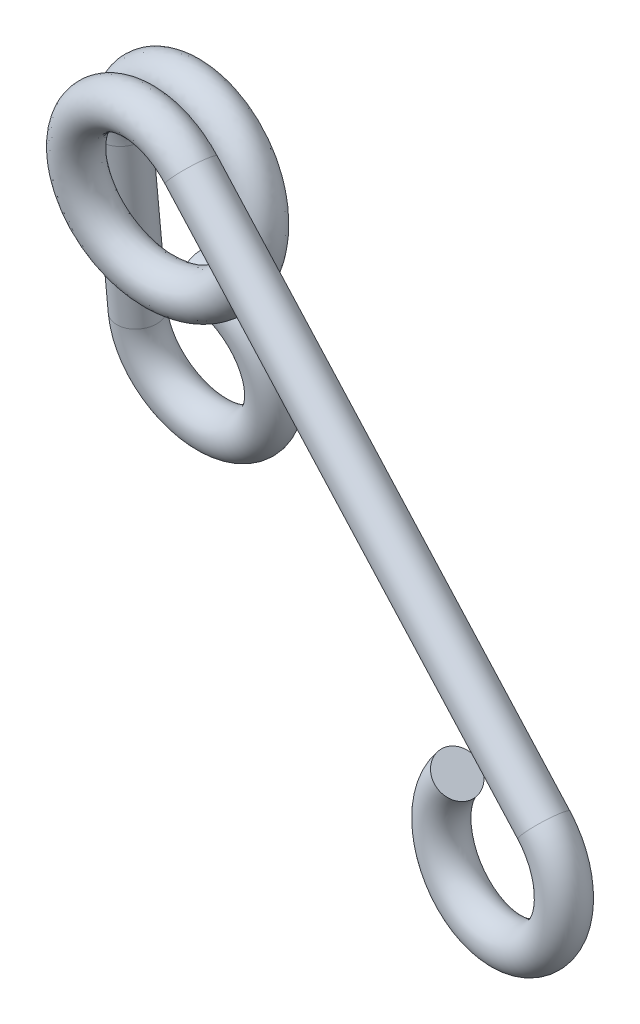
ISO-10303-21;
HEADER;
FILE_DESCRIPTION(('STEP AP214'),'2;1');
FILE_NAME('part.step','',(''),(''),'','','');
FILE_SCHEMA(('AUTOMOTIVE_DESIGN { 1 0 10303 214 1 1 1 1 }'));
ENDSEC;
DATA;
#1=APPLICATION_CONTEXT('core data for automotive mechanical design processes');
#2=APPLICATION_PROTOCOL_DEFINITION('international standard','automotive_design',2000,#1);
#3=PRODUCT_CONTEXT('',#1,'mechanical');
#4=PRODUCT('Part','Part','',(#3));
#5=PRODUCT_RELATED_PRODUCT_CATEGORY('part','',(#4));
#6=PRODUCT_DEFINITION_FORMATION('','',#4);
#7=PRODUCT_DEFINITION_CONTEXT('part definition',#1,'design');
#8=PRODUCT_DEFINITION('design','',#6,#7);
#9=PRODUCT_DEFINITION_SHAPE('','',#8);
#10=(LENGTH_UNIT() NAMED_UNIT(*) SI_UNIT(.MILLI.,.METRE.));
#11=(NAMED_UNIT(*) PLANE_ANGLE_UNIT() SI_UNIT($,.RADIAN.));
#12=(NAMED_UNIT(*) SI_UNIT($,.STERADIAN.) SOLID_ANGLE_UNIT());
#13=UNCERTAINTY_MEASURE_WITH_UNIT(LENGTH_MEASURE(1.E-05),#10,'distance_accuracy_value','');
#14=(GEOMETRIC_REPRESENTATION_CONTEXT(3) GLOBAL_UNCERTAINTY_ASSIGNED_CONTEXT((#13)) GLOBAL_UNIT_ASSIGNED_CONTEXT((#10,
#11,#12)) REPRESENTATION_CONTEXT('',''));
#15=CARTESIAN_POINT('',(0.,0.,0.));
#16=DIRECTION('',(0.,0.,1.));
#17=DIRECTION('',(1.,0.,0.));
#18=AXIS2_PLACEMENT_3D('',#15,#16,#17);
#19=CARTESIAN_POINT('',(-2.925,-0.0704165836283418,0.765267113333714));
#20=CARTESIAN_POINT('',(-2.94787973496228,0.879973527852909,0.849821792025935));
#21=CARTESIAN_POINT('',(-2.40776453792028,1.66230365011433,0.934376470718156));
#22=CARTESIAN_POINT('',(-1.86764934087828,2.44463377237575,1.01893114941038));
#23=CARTESIAN_POINT('',(-0.970844859261699,2.76008038913634,1.1034858281026));
#24=CARTESIAN_POINT('',(-0.0740403776451164,3.07552700589693,1.18804050679482));
#25=CARTESIAN_POINT('',(0.836904557831744,2.80360023119031,1.27259518548704));
#26=CARTESIAN_POINT('',(1.7478494933086,2.53167345648368,1.35714986417926));
#27=CARTESIAN_POINT('',(2.32498487917316,1.77624007579664,1.44170454287148));
#28=CARTESIAN_POINT('',(2.90212026503772,1.02080669510959,1.5262592215637));
#29=CARTESIAN_POINT('',(2.925,0.0704165836283421,1.61081390025592));
#30=CARTESIAN_POINT('',(2.94787973496228,-0.879973527852909,1.69536857894815));
#31=CARTESIAN_POINT('',(2.40776453792028,-1.66230365011433,1.77992325764037));
#32=CARTESIAN_POINT('',(1.86764934087828,-2.44463377237575,1.86447793633259));
#33=CARTESIAN_POINT('',(0.970844859261699,-2.76008038913634,1.94903261502481));
#34=CARTESIAN_POINT('',(0.0740403776451167,-3.07552700589693,2.03358729371703));
#35=CARTESIAN_POINT('',(-0.836904557831744,-2.80360023119031,2.11814197240925));
#36=CARTESIAN_POINT('',(-1.7478494933086,-2.53167345648368,2.20269665110147));
#37=CARTESIAN_POINT('',(-2.32498487917316,-1.77624007579664,2.28725132979369));
#38=CARTESIAN_POINT('',(-2.90212026503772,-1.02080669510959,2.37180600848591));
#39=CARTESIAN_POINT('',(-2.925,-0.0704165836283418,2.45636068717813));
#40=CARTESIAN_POINT('',(-2.94787973496228,0.879973527852909,2.54091536587035));
#41=CARTESIAN_POINT('',(-2.40776453792028,1.66230365011433,2.62547004456258));
#42=CARTESIAN_POINT('',(-1.86764934087828,2.44463377237575,2.7100247232548));
#43=CARTESIAN_POINT('',(-0.970844859261699,2.76008038913634,2.79457940194702));
#44=CARTESIAN_POINT('',(-0.0740403776451164,3.07552700589693,2.87913408063924));
#45=CARTESIAN_POINT('',(0.836904557831744,2.80360023119031,2.96368875933146));
#46=CARTESIAN_POINT('',(1.39393760480731,2.63731992821044,3.01539303746471));
#47=CARTESIAN_POINT('',(1.8450967933813,2.27072704619114,3.06959240479364));
#48=CARTESIAN_POINT('',(-1.388,-0.0704165836283317,0.765267113333715));
#49=CARTESIAN_POINT('',(-1.41087973496228,0.380571954742942,0.849821792025936));
#50=CARTESIAN_POINT('',(-1.16430541756598,0.758877717340808,0.934376470718157));
#51=CARTESIAN_POINT('',(-0.917731100169684,1.13718347993867,1.01893114941038));
#52=CARTESIAN_POINT('',(-0.495885738907395,1.29830652359069,1.1034858281026));
#53=CARTESIAN_POINT('',(-0.0740403776451057,1.45942956724271,1.18804050679482));
#54=CARTESIAN_POINT('',(0.361945437477459,1.34182636564465,1.27259518548704));
#55=CARTESIAN_POINT('',(0.797931252600025,1.22422316404659,1.35714986417926));
#56=CARTESIAN_POINT('',(1.08152575881887,0.872814143023098,1.44170454287148));
#57=CARTESIAN_POINT('',(1.36512026503772,0.521405121999606,1.5262592215637));
#58=CARTESIAN_POINT('',(1.388,0.0704165836283319,1.61081390025592));
#59=CARTESIAN_POINT('',(1.41087973496228,-0.380571954742942,1.69536857894815));
#60=CARTESIAN_POINT('',(1.16430541756598,-0.758877717340808,1.77992325764037));
#61=CARTESIAN_POINT('',(0.917731100169684,-1.13718347993867,1.86447793633259));
#62=CARTESIAN_POINT('',(0.495885738907395,-1.29830652359069,1.94903261502481));
#63=CARTESIAN_POINT('',(0.0740403776451059,-1.45942956724271,2.03358729371703));
#64=CARTESIAN_POINT('',(-0.361945437477459,-1.34182636564465,2.11814197240925));
#65=CARTESIAN_POINT('',(-0.797931252600024,-1.22422316404659,2.20269665110147));
#66=CARTESIAN_POINT('',(-1.08152575881887,-0.872814143023098,2.28725132979369));
#67=CARTESIAN_POINT('',(-1.36512026503772,-0.521405121999606,2.37180600848591));
#68=CARTESIAN_POINT('',(-1.388,-0.0704165836283317,2.45636068717813));
#69=CARTESIAN_POINT('',(-1.41087973496228,0.380571954742942,2.54091536587036));
#70=CARTESIAN_POINT('',(-1.16430541756598,0.758877717340808,2.62547004456258));
#71=CARTESIAN_POINT('',(-0.917731100169684,1.13718347993867,2.7100247232548));
#72=CARTESIAN_POINT('',(-0.495885738907395,1.29830652359069,2.79457940194702));
#73=CARTESIAN_POINT('',(-0.0740403776451057,1.45942956724271,2.87913408063924));
#74=CARTESIAN_POINT('',(0.361945437477459,1.34182636564465,2.96368875933146));
#75=CARTESIAN_POINT('',(0.628546082124238,1.26991327060564,3.01539303746471));
#76=CARTESIAN_POINT('',(0.847406714113215,1.10154634769751,3.06959240479364));
#77=CARTESIAN_POINT('',(-1.388,0.0704165836283109,-0.765267113333713));
#78=CARTESIAN_POINT('',(-1.36512026503773,0.521405121999585,-0.680712434641492));
#79=CARTESIAN_POINT('',(-1.08152575881889,0.872814143023081,-0.596157755949271));
#80=CARTESIAN_POINT('',(-0.797931252600042,1.22422316404658,-0.51160307725705));
#81=CARTESIAN_POINT('',(-0.361945437477479,1.34182636564465,-0.427048398564829));
#82=CARTESIAN_POINT('',(0.0740403776450837,1.45942956724271,-0.342493719872609));
#83=CARTESIAN_POINT('',(0.495885738907375,1.2983065235907,-0.257939041180387));
#84=CARTESIAN_POINT('',(0.917731100169666,1.13718347993869,-0.173384362488166));
#85=CARTESIAN_POINT('',(1.16430541756597,0.758877717340825,-0.0888296837959456));
#86=CARTESIAN_POINT('',(1.41087973496227,0.380571954742963,-0.00427500510372461));
#87=CARTESIAN_POINT('',(1.388,-0.0704165836283108,0.0802796735884963));
#88=CARTESIAN_POINT('',(1.36512026503773,-0.521405121999585,0.164834352280717));
#89=CARTESIAN_POINT('',(1.08152575881889,-0.872814143023081,0.249389030972938));
#90=CARTESIAN_POINT('',(0.797931252600043,-1.22422316404658,0.333943709665159));
#91=CARTESIAN_POINT('',(0.361945437477479,-1.34182636564465,0.41849838835738));
#92=CARTESIAN_POINT('',(-0.0740403776450835,-1.45942956724271,0.503053067049601));
#93=CARTESIAN_POINT('',(-0.495885738907374,-1.2983065235907,0.587607745741822));
#94=CARTESIAN_POINT('',(-0.917731100169666,-1.13718347993869,0.672162424434043));
#95=CARTESIAN_POINT('',(-1.16430541756597,-0.758877717340825,0.756717103126264));
#96=CARTESIAN_POINT('',(-1.41087973496227,-0.380571954742964,0.841271781818485));
#97=CARTESIAN_POINT('',(-1.388,0.0704165836283109,0.925826460510706));
#98=CARTESIAN_POINT('',(-1.36512026503773,0.521405121999585,1.01038113920293));
#99=CARTESIAN_POINT('',(-1.08152575881889,0.872814143023081,1.09493581789515));
#100=CARTESIAN_POINT('',(-0.797931252600042,1.22422316404658,1.17949049658737));
#101=CARTESIAN_POINT('',(-0.361945437477479,1.34182636564465,1.26404517527959));
#102=CARTESIAN_POINT('',(0.0740403776450837,1.45942956724271,1.34859985397181));
#103=CARTESIAN_POINT('',(0.495885738907375,1.2983065235907,1.43315453266403));
#104=CARTESIAN_POINT('',(0.753839647848572,1.19978151242032,1.48485881079728));
#105=CARTESIAN_POINT('',(0.954537111552505,1.01012939662148,1.53905817812621));
#106=CARTESIAN_POINT('',(-2.925,0.0704165836283009,-0.765267113333714));
#107=CARTESIAN_POINT('',(-2.90212026503773,1.02080669510955,-0.680712434641493));
#108=CARTESIAN_POINT('',(-2.32498487917319,1.7762400757966,-0.596157755949272));
#109=CARTESIAN_POINT('',(-1.74784949330864,2.53167345648366,-0.511603077257051));
#110=CARTESIAN_POINT('',(-0.836904557831783,2.80360023119029,-0.42704839856483));
#111=CARTESIAN_POINT('',(0.074040377645073,3.07552700589693,-0.342493719872609));
#112=CARTESIAN_POINT('',(0.970844859261659,2.76008038913636,-0.257939041180388));
#113=CARTESIAN_POINT('',(1.86764934087825,2.44463377237578,-0.173384362488167));
#114=CARTESIAN_POINT('',(2.40776453792026,1.66230365011436,-0.0888296837959465));
#115=CARTESIAN_POINT('',(2.94787973496227,0.879973527852951,-0.00427500510372558));
#116=CARTESIAN_POINT('',(2.925,-0.0704165836283006,0.0802796735884954));
#117=CARTESIAN_POINT('',(2.90212026503773,-1.02080669510955,0.164834352280716));
#118=CARTESIAN_POINT('',(2.32498487917319,-1.7762400757966,0.249389030972937));
#119=CARTESIAN_POINT('',(1.74784949330864,-2.53167345648366,0.333943709665158));
#120=CARTESIAN_POINT('',(0.836904557831784,-2.80360023119029,0.418498388357379));
#121=CARTESIAN_POINT('',(-0.0740403776450727,-3.07552700589693,0.5030530670496));
#122=CARTESIAN_POINT('',(-0.970844859261659,-2.76008038913636,0.587607745741821));
#123=CARTESIAN_POINT('',(-1.86764934087825,-2.44463377237578,0.672162424434042));
#124=CARTESIAN_POINT('',(-2.40776453792026,-1.66230365011436,0.756717103126263));
#125=CARTESIAN_POINT('',(-2.94787973496227,-0.879973527852951,0.841271781818484));
#126=CARTESIAN_POINT('',(-2.925,0.0704165836283009,0.925826460510705));
#127=CARTESIAN_POINT('',(-2.90212026503773,1.02080669510955,1.01038113920293));
#128=CARTESIAN_POINT('',(-2.32498487917319,1.7762400757966,1.09493581789515));
#129=CARTESIAN_POINT('',(-1.74784949330864,2.53167345648366,1.17949049658737));
#130=CARTESIAN_POINT('',(-0.836904557831783,2.80360023119029,1.26404517527959));
#131=CARTESIAN_POINT('',(0.074040377645073,3.07552700589693,1.34859985397181));
#132=CARTESIAN_POINT('',(0.970844859261659,2.76008038913636,1.43315453266403));
#133=CARTESIAN_POINT('',(1.51923117053165,2.56718817002511,1.48485881079728));
#134=CARTESIAN_POINT('',(1.9522271908206,2.17931009511511,1.53905817812621));
#135=CARTESIAN_POINT('',(-4.462,0.0704165836282909,-0.765267113333715));
#136=CARTESIAN_POINT('',(-4.43912026503774,1.52020826821952,-0.680712434641494));
#137=CARTESIAN_POINT('',(-3.56844399952749,2.67966600857013,-0.596157755949273));
#138=CARTESIAN_POINT('',(-2.69776773401724,3.83912374892074,-0.511603077257052));
#139=CARTESIAN_POINT('',(-1.31186367818609,4.26537409673594,-0.427048398564832));
#140=CARTESIAN_POINT('',(0.0740403776450624,4.69162444455115,-0.342493719872611));
#141=CARTESIAN_POINT('',(1.44580397961594,4.22185425468201,-0.25793904118039));
#142=CARTESIAN_POINT('',(2.81756758158683,3.75208406481287,-0.173384362488169));
#143=CARTESIAN_POINT('',(3.65122365827454,2.5657295828879,-0.0888296837959476));
#144=CARTESIAN_POINT('',(4.48487973496226,1.37937510096294,-0.00427500510372667));
#145=CARTESIAN_POINT('',(4.462,-0.0704165836282903,0.0802796735884943));
#146=CARTESIAN_POINT('',(4.43912026503774,-1.52020826821952,0.164834352280715));
#147=CARTESIAN_POINT('',(3.56844399952749,-2.67966600857013,0.249389030972936));
#148=CARTESIAN_POINT('',(2.69776773401724,-3.83912374892074,0.333943709665157));
#149=CARTESIAN_POINT('',(1.31186367818609,-4.26537409673594,0.418498388357378));
#150=CARTESIAN_POINT('',(-0.0740403776450618,-4.69162444455115,0.503053067049599));
#151=CARTESIAN_POINT('',(-1.44580397961594,-4.22185425468201,0.58760774574182));
#152=CARTESIAN_POINT('',(-2.81756758158683,-3.75208406481287,0.672162424434041));
#153=CARTESIAN_POINT('',(-3.65122365827454,-2.5657295828879,0.756717103126262));
#154=CARTESIAN_POINT('',(-4.48487973496226,-1.37937510096294,0.841271781818483));
#155=CARTESIAN_POINT('',(-4.462,0.0704165836282909,0.925826460510704));
#156=CARTESIAN_POINT('',(-4.43912026503774,1.52020826821952,1.01038113920293));
#157=CARTESIAN_POINT('',(-3.56844399952749,2.67966600857013,1.09493581789515));
#158=CARTESIAN_POINT('',(-2.69776773401724,3.83912374892074,1.17949049658737));
#159=CARTESIAN_POINT('',(-1.31186367818609,4.26537409673594,1.26404517527959));
#160=CARTESIAN_POINT('',(0.0740403776450624,4.69162444455115,1.34859985397181));
#161=CARTESIAN_POINT('',(1.44580397961594,4.22185425468201,1.43315453266403));
#162=CARTESIAN_POINT('',(2.28462269321472,3.93459482762991,1.48485881079728));
#163=CARTESIAN_POINT('',(2.94991727008868,3.34849079360873,1.53905817812621));
#164=CARTESIAN_POINT('',(-4.462,-0.0704165836283518,0.765267113333713));
#165=CARTESIAN_POINT('',(-4.48487973496228,1.37937510096288,0.849821792025934));
#166=CARTESIAN_POINT('',(-3.65122365827458,2.56572958288785,0.934376470718155));
#167=CARTESIAN_POINT('',(-2.81756758158688,3.75208406481283,1.01893114941038));
#168=CARTESIAN_POINT('',(-1.445803979616,4.22185425468199,1.1034858281026));
#169=CARTESIAN_POINT('',(-0.074040377645127,4.69162444455115,1.18804050679482));
#170=CARTESIAN_POINT('',(1.31186367818603,4.26537409673596,1.27259518548704));
#171=CARTESIAN_POINT('',(2.69776773401718,3.83912374892077,1.35714986417926));
#172=CARTESIAN_POINT('',(3.56844399952745,2.67966600857018,1.44170454287148));
#173=CARTESIAN_POINT('',(4.43912026503772,1.52020826821958,1.5262592215637));
#174=CARTESIAN_POINT('',(4.462,0.0704165836283523,1.61081390025592));
#175=CARTESIAN_POINT('',(4.48487973496228,-1.37937510096288,1.69536857894814));
#176=CARTESIAN_POINT('',(3.65122365827458,-2.56572958288785,1.77992325764037));
#177=CARTESIAN_POINT('',(2.81756758158688,-3.75208406481283,1.86447793633259));
#178=CARTESIAN_POINT('',(1.445803979616,-4.22185425468199,1.94903261502481));
#179=CARTESIAN_POINT('',(0.0740403776451276,-4.69162444455115,2.03358729371703));
#180=CARTESIAN_POINT('',(-1.31186367818603,-4.26537409673596,2.11814197240925));
#181=CARTESIAN_POINT('',(-2.69776773401718,-3.83912374892078,2.20269665110147));
#182=CARTESIAN_POINT('',(-3.56844399952745,-2.67966600857018,2.28725132979369));
#183=CARTESIAN_POINT('',(-4.43912026503772,-1.52020826821958,2.37180600848591));
#184=CARTESIAN_POINT('',(-4.462,-0.0704165836283518,2.45636068717813));
#185=CARTESIAN_POINT('',(-4.48487973496228,1.37937510096288,2.54091536587035));
#186=CARTESIAN_POINT('',(-3.65122365827458,2.56572958288785,2.62547004456257));
#187=CARTESIAN_POINT('',(-2.81756758158688,3.75208406481283,2.7100247232548));
#188=CARTESIAN_POINT('',(-1.445803979616,4.22185425468199,2.79457940194702));
#189=CARTESIAN_POINT('',(-0.074040377645127,4.69162444455115,2.87913408063924));
#190=CARTESIAN_POINT('',(1.31186367818603,4.26537409673596,2.96368875933146));
#191=CARTESIAN_POINT('',(2.15932912749038,4.00472658581523,3.01539303746471));
#192=CARTESIAN_POINT('',(2.84278687264939,3.43990774468476,3.06959240479364));
#193=CARTESIAN_POINT('',(-2.925,-0.0704165836283418,0.765267113333714));
#194=CARTESIAN_POINT('',(-2.94787973496228,0.879973527852909,0.849821792025935));
#195=CARTESIAN_POINT('',(-2.40776453792028,1.66230365011433,0.934376470718156));
#196=CARTESIAN_POINT('',(-1.86764934087828,2.44463377237575,1.01893114941038));
#197=CARTESIAN_POINT('',(-0.970844859261699,2.76008038913634,1.1034858281026));
#198=CARTESIAN_POINT('',(-0.0740403776451164,3.07552700589693,1.18804050679482));
#199=CARTESIAN_POINT('',(0.836904557831744,2.80360023119031,1.27259518548704));
#200=CARTESIAN_POINT('',(1.7478494933086,2.53167345648368,1.35714986417926));
#201=CARTESIAN_POINT('',(2.32498487917316,1.77624007579664,1.44170454287148));
#202=CARTESIAN_POINT('',(2.90212026503772,1.02080669510959,1.5262592215637));
#203=CARTESIAN_POINT('',(2.925,0.0704165836283421,1.61081390025592));
#204=CARTESIAN_POINT('',(2.94787973496228,-0.879973527852909,1.69536857894815));
#205=CARTESIAN_POINT('',(2.40776453792028,-1.66230365011433,1.77992325764037));
#206=CARTESIAN_POINT('',(1.86764934087828,-2.44463377237575,1.86447793633259));
#207=CARTESIAN_POINT('',(0.970844859261699,-2.76008038913634,1.94903261502481));
#208=CARTESIAN_POINT('',(0.0740403776451167,-3.07552700589693,2.03358729371703));
#209=CARTESIAN_POINT('',(-0.836904557831744,-2.80360023119031,2.11814197240925));
#210=CARTESIAN_POINT('',(-1.7478494933086,-2.53167345648368,2.20269665110147));
#211=CARTESIAN_POINT('',(-2.32498487917316,-1.77624007579664,2.28725132979369));
#212=CARTESIAN_POINT('',(-2.90212026503772,-1.02080669510959,2.37180600848591));
#213=CARTESIAN_POINT('',(-2.925,-0.0704165836283418,2.45636068717813));
#214=CARTESIAN_POINT('',(-2.94787973496228,0.879973527852909,2.54091536587035));
#215=CARTESIAN_POINT('',(-2.40776453792028,1.66230365011433,2.62547004456258));
#216=CARTESIAN_POINT('',(-1.86764934087828,2.44463377237575,2.7100247232548));
#217=CARTESIAN_POINT('',(-0.970844859261699,2.76008038913634,2.79457940194702));
#218=CARTESIAN_POINT('',(-0.0740403776451164,3.07552700589693,2.87913408063924));
#219=CARTESIAN_POINT('',(0.836904557831744,2.80360023119031,2.96368875933146));
#220=CARTESIAN_POINT('',(1.39393760480731,2.63731992821044,3.01539303746471));
#221=CARTESIAN_POINT('',(1.8450967933813,2.27072704619114,3.06959240479364));
#222=(BOUNDED_SURFACE() B_SPLINE_SURFACE(3,2,((#19,#20,#21,#22,#23,#24,#25,#26,#27,#28,#29,#30,
#31,#32,#33,#34,#35,#36,#37,#38,#39,#40,#41,#42,#43,#44,#45,#46,#47),(#48,#49,#50,#51,#52,#53,
#54,#55,#56,#57,#58,#59,#60,#61,#62,#63,#64,#65,#66,#67,#68,#69,#70,#71,#72,#73,#74,#75,#76),
(#77,#78,#79,#80,#81,#82,#83,#84,#85,#86,#87,#88,#89,#90,#91,#92,#93,#94,#95,#96,#97,#98,#99,
#100,#101,#102,#103,#104,#105),(#106,#107,#108,#109,#110,#111,#112,#113,#114,#115,#116,#117,
#118,#119,#120,#121,#122,#123,#124,#125,#126,#127,#128,#129,#130,#131,#132,#133,#134),(#135,
#136,#137,#138,#139,#140,#141,#142,#143,#144,#145,#146,#147,#148,#149,#150,#151,#152,#153,#154,
#155,#156,#157,#158,#159,#160,#161,#162,#163),(#164,#165,#166,#167,#168,#169,#170,#171,#172,
#173,#174,#175,#176,#177,#178,#179,#180,#181,#182,#183,#184,#185,#186,#187,#188,#189,#190,#191,
#192),(#193,#194,#195,#196,#197,#198,#199,#200,#201,#202,#203,#204,#205,#206,#207,#208,#209,
#210,#211,#212,#213,#214,#215,#216,#217,#218,#219,#220,#221)),.UNSPECIFIED.,.T.,.F.,
.F.) B_SPLINE_SURFACE_WITH_KNOTS((4,3,4),(3,2,2,2,2,2,2,2,2,2,2,2,2,2,3),(0.,0.5,1.),(0.,0.05,
0.1,0.15,0.2,0.25,0.3,0.35,0.4,0.45,0.5,0.55,0.6,0.65,0.681167107840343),
.UNSPECIFIED.) GEOMETRIC_REPRESENTATION_ITEM() RATIONAL_B_SPLINE_SURFACE(((1.,0.951056516295154,
1.,0.951056516295154,1.,0.951056516295154,1.,0.951056516295154,1.,0.951056516295154,1.,
0.951056516295154,1.,0.951056516295154,1.,0.951056516295154,1.,0.951056516295154,1.,
0.951056516295154,1.,0.951056516295154,1.,0.951056516295154,1.,0.951056516295154,1.,
0.96949146330578,0.977017440739552),(0.333333333333333,0.317018838765051,0.333333333333333,
0.317018838765051,0.333333333333333,0.317018838765051,0.333333333333333,0.317018838765051,
0.333333333333333,0.317018838765051,0.333333333333333,0.317018838765051,0.333333333333333,
0.317018838765051,0.333333333333333,0.317018838765051,0.333333333333333,0.317018838765051,
0.333333333333333,0.317018838765051,0.333333333333333,0.317018838765051,0.333333333333333,
0.317018838765051,0.333333333333333,0.317018838765051,0.333333333333333,0.323163821101927,
0.325672480246517),(0.333333333333333,0.317018838765051,0.333333333333333,0.317018838765051,
0.333333333333333,0.317018838765051,0.333333333333333,0.317018838765051,0.333333333333333,
0.317018838765051,0.333333333333333,0.317018838765051,0.333333333333333,0.317018838765051,
0.333333333333333,0.317018838765051,0.333333333333333,0.317018838765051,0.333333333333333,
0.317018838765051,0.333333333333333,0.317018838765051,0.333333333333333,0.317018838765051,
0.333333333333333,0.317018838765051,0.333333333333333,0.323163821101927,0.325672480246517),(1.,
0.951056516295154,1.,0.951056516295154,1.,0.951056516295154,1.,0.951056516295154,1.,
0.951056516295154,1.,0.951056516295154,1.,0.951056516295154,1.,0.951056516295154,1.,
0.951056516295154,1.,0.951056516295154,1.,0.951056516295154,1.,0.951056516295154,1.,
0.951056516295154,1.,0.96949146330578,0.977017440739552),(0.333333333333333,0.317018838765051,
0.333333333333333,0.317018838765051,0.333333333333333,0.317018838765051,0.333333333333333,
0.317018838765051,0.333333333333333,0.317018838765051,0.333333333333333,0.317018838765051,
0.333333333333333,0.317018838765051,0.333333333333333,0.317018838765051,0.333333333333333,
0.317018838765051,0.333333333333333,0.317018838765051,0.333333333333333,0.317018838765051,
0.333333333333333,0.317018838765051,0.333333333333333,0.317018838765051,0.333333333333333,
0.323163821101927,0.325672480246517),(0.333333333333333,0.317018838765051,0.333333333333333,
0.317018838765051,0.333333333333333,0.317018838765051,0.333333333333333,0.317018838765051,
0.333333333333333,0.317018838765051,0.333333333333333,0.317018838765051,0.333333333333333,
0.317018838765051,0.333333333333333,0.317018838765051,0.333333333333333,0.317018838765051,
0.333333333333333,0.317018838765051,0.333333333333333,0.317018838765051,0.333333333333333,
0.317018838765051,0.333333333333333,0.317018838765051,0.333333333333333,0.323163821101927,
0.325672480246517),(1.,0.951056516295154,1.,0.951056516295154,1.,0.951056516295154,1.,
0.951056516295154,1.,0.951056516295154,1.,0.951056516295154,1.,0.951056516295154,1.,
0.951056516295154,1.,0.951056516295154,1.,0.951056516295154,1.,0.951056516295154,1.,
0.951056516295154,1.,0.951056516295154,1.,0.96949146330578,0.977017440739552))) REPRESENTATION_ITEM('') SURFACE());
#223=CARTESIAN_POINT('',(-2.925,0.,0.));
#224=DIRECTION('',(0.,-0.995793250922205,-0.0916286058924155));
#225=DIRECTION('',(0.,0.0916286058924155,-0.995793250922205));
#226=AXIS2_PLACEMENT_3D('',#223,#224,#225);
#227=CIRCLE('',#226,0.7685);
#228=CARTESIAN_POINT('',(-2.925,0.070416583628302,-0.765267113333714));
#229=VERTEX_POINT('',#228);
#230=EDGE_CURVE('E49',#229,#229,#227,.T.);
#231=CARTESIAN_POINT('',(1.8450967933813,2.27072704619114,3.06959240479364));
#232=CARTESIAN_POINT('',(2.84278687264939,3.43990774468476,3.06959240479364));
#233=CARTESIAN_POINT('',(2.94991727008868,3.34849079360873,1.53905817812621));
#234=CARTESIAN_POINT('',(1.9522271908206,2.17931009511511,1.53905817812621));
#235=CARTESIAN_POINT('',(0.954537111552505,1.01012939662148,1.53905817812621));
#236=CARTESIAN_POINT('',(0.847406714113215,1.10154634769751,3.06959240479364));
#237=CARTESIAN_POINT('',(1.8450967933813,2.27072704619114,3.06959240479364));
#238=(BOUNDED_CURVE() B_SPLINE_CURVE(3,(#231,#232,#233,#234,#235,#236,#237),.UNSPECIFIED.,.T.,
.F.) B_SPLINE_CURVE_WITH_KNOTS((4,3,4),(0.,0.5,1.),
.UNSPECIFIED.) CURVE() GEOMETRIC_REPRESENTATION_ITEM() RATIONAL_B_SPLINE_CURVE((0.977017440739552,
0.325672480246517,0.325672480246517,0.977017440739552,0.325672480246517,0.325672480246517,0.977017440739552)) REPRESENTATION_ITEM(''));
#239=CARTESIAN_POINT('',(1.8450967933813,2.27072704619114,3.06959240479364));
#240=VERTEX_POINT('',#239);
#241=EDGE_CURVE('E63',#240,#240,#238,.F.);
#242=ORIENTED_EDGE('',*,*,#230,.F.);
#243=EDGE_LOOP('',(#242));
#244=FACE_BOUND('',#243,.T.);
#245=ORIENTED_EDGE('',*,*,#241,.F.);
#246=EDGE_LOOP('',(#245));
#247=FACE_BOUND('',#246,.T.);
#248=ADVANCED_FACE('F37',(#244,#247),#222,.T.);
#249=CARTESIAN_POINT('',(-2.92499999999996,-6.08628834963653,-0.560034039214444));
#250=DIRECTION('',(0.,0.995793250922205,0.0916286058924155));
#251=DIRECTION('',(0.,-0.0916286058924155,0.995793250922205));
#252=AXIS2_PLACEMENT_3D('',#249,#250,#251);
#253=CYLINDRICAL_SURFACE('',#252,0.7685);
#254=CARTESIAN_POINT('',(-2.92499999999996,-6.08628834963653,-0.560034039214444));
#255=DIRECTION('',(0.,-0.995793250922205,-0.0916286058924155));
#256=DIRECTION('',(0.,0.0916286058924155,-0.995793250922205));
#257=AXIS2_PLACEMENT_3D('',#254,#255,#256);
#258=CIRCLE('',#257,0.7685);
#259=CARTESIAN_POINT('',(-3.69349999999996,-6.08628834963653,-0.560034039214443));
#260=VERTEX_POINT('',#259);
#261=EDGE_CURVE('E11',#260,#260,#258,.T.);
#262=ORIENTED_EDGE('',*,*,#261,.F.);
#263=EDGE_LOOP('',(#262));
#264=FACE_BOUND('',#263,.T.);
#265=ORIENTED_EDGE('',*,*,#230,.T.);
#266=EDGE_LOOP('',(#265));
#267=FACE_BOUND('',#266,.T.);
#268=ADVANCED_FACE('F93',(#264,#267),#253,.T.);
#269=CARTESIAN_POINT('',(16.6257840731759,-10.3419897757805,4.08576864722026));
#270=DIRECTION('',(-0.757490077207845,0.646384546159533,-0.0916286058924153));
#271=DIRECTION('',(-0.649115210974684,-0.760690109624998,0.));
#272=AXIS2_PLACEMENT_3D('',#269,#270,#271);
#273=CYLINDRICAL_SURFACE('',#272,0.7685);
#274=CARTESIAN_POINT('',(16.6257840731759,-10.3419897757805,4.08576864722026));
#275=DIRECTION('',(0.757490077207845,-0.646384546159533,0.0916286058924153));
#276=DIRECTION('',(0.649115210974684,0.760690109624998,0.));
#277=AXIS2_PLACEMENT_3D('',#274,#275,#276);
#278=CIRCLE('',#277,0.7685);
#279=CARTESIAN_POINT('',(17.1220495121511,-9.75602759071399,4.11677157854609));
#280=VERTEX_POINT('',#279);
#281=EDGE_CURVE('E54',#280,#280,#278,.T.);
#282=ORIENTED_EDGE('',*,*,#281,.F.);
#283=EDGE_LOOP('',(#282));
#284=FACE_BOUND('',#283,.T.);
#285=ORIENTED_EDGE('',*,*,#241,.T.);
#286=EDGE_LOOP('',(#285));
#287=FACE_BOUND('',#286,.T.);
#288=ADVANCED_FACE('F72',(#284,#287),#273,.T.);
#289=CARTESIAN_POINT('',(-0.424999999999966,-3.59680522233103,-0.330962524483405));
#290=DIRECTION('',(-1.,0.,0.));
#291=DIRECTION('',(0.,0.0916286058924154,-0.995793250922205));
#292=AXIS2_PLACEMENT_3D('',#289,#290,#291);
#293=PLANE('',#292);
#294=CARTESIAN_POINT('',(-0.424999999999966,-3.59680522233103,-0.330962524483405));
#295=DIRECTION('',(-1.,0.,0.));
#296=DIRECTION('',(0.,0.0916286058924154,-0.995793250922205));
#297=AXIS2_PLACEMENT_3D('',#294,#295,#296);
#298=CIRCLE('',#297,0.7685);
#299=CARTESIAN_POINT('',(-0.424999999999968,-2.83153810899731,-0.260545940855084));
#300=VERTEX_POINT('',#299);
#301=EDGE_CURVE('E73',#300,#300,#298,.T.);
#302=ORIENTED_EDGE('',*,*,#301,.T.);
#303=EDGE_LOOP('',(#302));
#304=FACE_BOUND('',#303,.T.);
#305=ADVANCED_FACE('F89',(#304),#293,.T.);
#306=CARTESIAN_POINT('',(-0.424999999999959,-6.08628834963654,-0.560034039214445));
#307=DIRECTION('',(0.,-0.0916286058924155,0.995793250922204));
#308=DIRECTION('',(0.,-0.995793250922204,-0.0916286058924155));
#309=AXIS2_PLACEMENT_3D('',#306,#307,#308);
#310=TOROIDAL_SURFACE('',#309,2.5,0.7685);
#311=CARTESIAN_POINT('',(-0.424999999999959,-6.08628834963654,-0.560034039214445));
#312=DIRECTION('',(0.,-0.0916286058924155,0.995793250922204));
#313=DIRECTION('',(0.,-0.995793250922204,-0.0916286058924155));
#314=AXIS2_PLACEMENT_3D('',#311,#312,#313);
#315=CIRCLE('',#314,3.2685);
#316=EDGE_CURVE('',#260,#300,#315,.T.);
#317=ORIENTED_EDGE('',*,*,#261,.T.);
#318=ORIENTED_EDGE('',*,*,#301,.F.);
#319=ORIENTED_EDGE('',*,*,#316,.T.);
#320=ORIENTED_EDGE('',*,*,#316,.F.);
#321=EDGE_LOOP('',(#317,#319,#318,#320));
#322=FACE_BOUND('',#321,.T.);
#323=ADVANCED_FACE('F94',(#322),#310,.T.);
#324=CARTESIAN_POINT('',(13.1176625269513,-10.632216390429,3.75584179310787));
#325=DIRECTION('',(0.645758541281994,0.762475192018911,0.0403421357525442));
#326=DIRECTION('',(-0.752981381326759,0.644694770799952,-0.13186239751515));
#327=AXIS2_PLACEMENT_3D('',#324,#325,#326);
#328=PLANE('',#327);
#329=CARTESIAN_POINT('',(13.1176625269513,-10.632216390429,3.75584179310787));
#330=DIRECTION('',(0.645758541281994,0.762475192018911,0.0403421357525442));
#331=DIRECTION('',(-0.752981381326759,0.644694770799952,-0.13186239751515));
#332=AXIS2_PLACEMENT_3D('',#329,#330,#331);
#333=CIRCLE('',#332,0.7685);
#334=CARTESIAN_POINT('',(12.5355314026171,-10.1354698667054,3.68542520947955));
#335=VERTEX_POINT('',#334);
#336=EDGE_CURVE('E76',#335,#335,#333,.T.);
#337=ORIENTED_EDGE('',*,*,#336,.T.);
#338=EDGE_LOOP('',(#337));
#339=FACE_BOUND('',#338,.T.);
#340=ADVANCED_FACE('F83',(#339),#328,.T.);
#341=CARTESIAN_POINT('',(15.0113877199709,-12.2481777558278,3.98491330783891));
#342=DIRECTION('',(0.0959410719817589,-0.0286111873548648,-0.994975733706675));
#343=DIRECTION('',(-0.9953832274932,0.,-0.0959803647899961));
#344=AXIS2_PLACEMENT_3D('',#341,#342,#343);
#345=TOROIDAL_SURFACE('',#344,2.5,0.7685);
#346=CARTESIAN_POINT('',(15.0113877199709,-12.2481777558278,3.98491330783891));
#347=DIRECTION('',(0.0959410719817589,-0.0286111873548648,-0.994975733706675));
#348=DIRECTION('',(-0.9953832274932,0.,-0.0959803647899961));
#349=AXIS2_PLACEMENT_3D('',#346,#347,#348);
#350=CIRCLE('',#349,3.2685);
#351=EDGE_CURVE('',#280,#335,#350,.T.);
#352=ORIENTED_EDGE('',*,*,#281,.T.);
#353=ORIENTED_EDGE('',*,*,#336,.F.);
#354=ORIENTED_EDGE('',*,*,#351,.T.);
#355=ORIENTED_EDGE('',*,*,#351,.F.);
#356=EDGE_LOOP('',(#352,#354,#353,#355));
#357=FACE_BOUND('',#356,.T.);
#358=ADVANCED_FACE('F85',(#357),#345,.T.);
#359=CLOSED_SHELL('',(#248,#268,#288,#305,#323,#340,#358));
#360=MANIFOLD_SOLID_BREP('B2',#359);
#361=ADVANCED_BREP_SHAPE_REPRESENTATION('',(#18,#360),#14);
#362=SHAPE_DEFINITION_REPRESENTATION(#9,#361);
ENDSEC;
END-ISO-10303-21;
